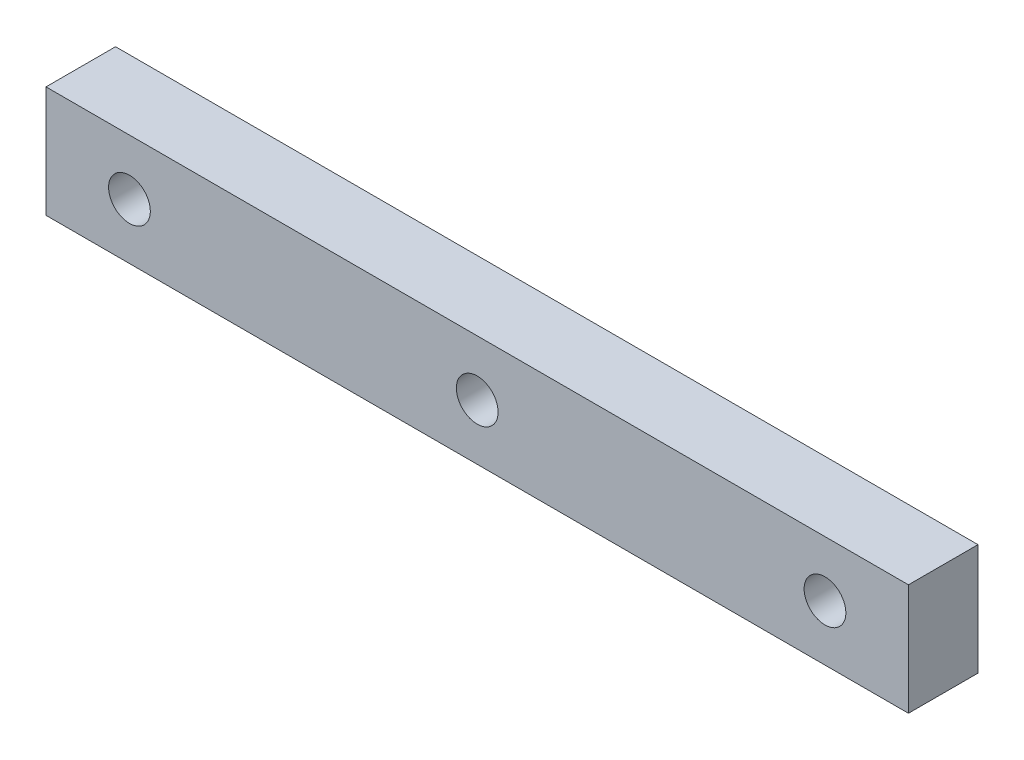
ISO-10303-21;
HEADER;
FILE_DESCRIPTION(('STEP AP214'),'2;1');
FILE_NAME('part.step','',(''),(''),'','','');
FILE_SCHEMA(('AUTOMOTIVE_DESIGN { 1 0 10303 214 1 1 1 1 }'));
ENDSEC;
DATA;
#1=APPLICATION_CONTEXT('core data for automotive mechanical design processes');
#2=APPLICATION_PROTOCOL_DEFINITION('international standard','automotive_design',2000,#1);
#3=PRODUCT_CONTEXT('',#1,'mechanical');
#4=PRODUCT('Part','Part','',(#3));
#5=PRODUCT_RELATED_PRODUCT_CATEGORY('part','',(#4));
#6=PRODUCT_DEFINITION_FORMATION('','',#4);
#7=PRODUCT_DEFINITION_CONTEXT('part definition',#1,'design');
#8=PRODUCT_DEFINITION('design','',#6,#7);
#9=PRODUCT_DEFINITION_SHAPE('','',#8);
#10=(LENGTH_UNIT() NAMED_UNIT(*) SI_UNIT(.MILLI.,.METRE.));
#11=(NAMED_UNIT(*) PLANE_ANGLE_UNIT() SI_UNIT($,.RADIAN.));
#12=(NAMED_UNIT(*) SI_UNIT($,.STERADIAN.) SOLID_ANGLE_UNIT());
#13=UNCERTAINTY_MEASURE_WITH_UNIT(LENGTH_MEASURE(1.E-05),#10,'distance_accuracy_value','');
#14=(GEOMETRIC_REPRESENTATION_CONTEXT(3) GLOBAL_UNCERTAINTY_ASSIGNED_CONTEXT((#13)) GLOBAL_UNIT_ASSIGNED_CONTEXT((#10,
#11,#12)) REPRESENTATION_CONTEXT('',''));
#15=CARTESIAN_POINT('',(0.,0.,0.));
#16=DIRECTION('',(0.,0.,1.));
#17=DIRECTION('',(1.,0.,0.));
#18=AXIS2_PLACEMENT_3D('',#15,#16,#17);
#19=CARTESIAN_POINT('',(-31.,4.,5.));
#20=DIRECTION('',(1.,0.,0.));
#21=DIRECTION('',(0.,0.,-1.));
#22=AXIS2_PLACEMENT_3D('',#19,#20,#21);
#23=PLANE('',#22);
#24=DIRECTION('',(0.,-1.,0.));
#25=VECTOR('',#24,1.);
#26=CARTESIAN_POINT('',(-31.,4.,0.));
#27=LINE('',#26,#25);
#28=CARTESIAN_POINT('',(-31.,4.,0.));
#29=VERTEX_POINT('',#28);
#30=CARTESIAN_POINT('',(-31.,-4.,0.));
#31=VERTEX_POINT('',#30);
#32=EDGE_CURVE('E97',#29,#31,#27,.T.);
#33=ORIENTED_EDGE('',*,*,#32,.T.);
#34=DIRECTION('',(0.,0.,-1.));
#35=VECTOR('',#34,1.);
#36=CARTESIAN_POINT('',(-31.,-4.,5.));
#37=LINE('',#36,#35);
#38=CARTESIAN_POINT('',(-31.,-4.,5.));
#39=VERTEX_POINT('',#38);
#40=EDGE_CURVE('E11',#39,#31,#37,.T.);
#41=ORIENTED_EDGE('',*,*,#40,.F.);
#42=DIRECTION('',(0.,-1.,0.));
#43=VECTOR('',#42,1.);
#44=CARTESIAN_POINT('',(-31.,4.,5.));
#45=LINE('',#44,#43);
#46=CARTESIAN_POINT('',(-31.,4.,5.));
#47=VERTEX_POINT('',#46);
#48=EDGE_CURVE('E85',#47,#39,#45,.T.);
#49=ORIENTED_EDGE('',*,*,#48,.F.);
#50=DIRECTION('',(0.,0.,-1.));
#51=VECTOR('',#50,1.);
#52=CARTESIAN_POINT('',(-31.,4.,5.));
#53=LINE('',#52,#51);
#54=EDGE_CURVE('E93',#47,#29,#53,.T.);
#55=ORIENTED_EDGE('',*,*,#54,.T.);
#56=EDGE_LOOP('',(#33,#41,#49,#55));
#57=FACE_BOUND('',#56,.T.);
#58=ADVANCED_FACE('F34',(#57),#23,.F.);
#59=CARTESIAN_POINT('',(-31.,-4.,5.));
#60=DIRECTION('',(0.,1.,0.));
#61=DIRECTION('',(-1.,0.,0.));
#62=AXIS2_PLACEMENT_3D('',#59,#60,#61);
#63=PLANE('',#62);
#64=DIRECTION('',(1.,0.,0.));
#65=VECTOR('',#64,1.);
#66=CARTESIAN_POINT('',(-31.,-4.,0.));
#67=LINE('',#66,#65);
#68=CARTESIAN_POINT('',(31.,-4.,0.));
#69=VERTEX_POINT('',#68);
#70=EDGE_CURVE('E89',#31,#69,#67,.T.);
#71=ORIENTED_EDGE('',*,*,#70,.T.);
#72=DIRECTION('',(0.,0.,-1.));
#73=VECTOR('',#72,1.);
#74=CARTESIAN_POINT('',(31.,-4.,5.));
#75=LINE('',#74,#73);
#76=CARTESIAN_POINT('',(31.,-4.,5.));
#77=VERTEX_POINT('',#76);
#78=EDGE_CURVE('E42',#77,#69,#75,.T.);
#79=ORIENTED_EDGE('',*,*,#78,.F.);
#80=DIRECTION('',(1.,0.,0.));
#81=VECTOR('',#80,1.);
#82=CARTESIAN_POINT('',(-31.,-4.,5.));
#83=LINE('',#82,#81);
#84=EDGE_CURVE('E80',#39,#77,#83,.T.);
#85=ORIENTED_EDGE('',*,*,#84,.F.);
#86=ORIENTED_EDGE('',*,*,#40,.T.);
#87=EDGE_LOOP('',(#71,#79,#85,#86));
#88=FACE_BOUND('',#87,.T.);
#89=ADVANCED_FACE('F88',(#88),#63,.F.);
#90=CARTESIAN_POINT('',(31.,4.,5.));
#91=DIRECTION('',(-1.,0.,0.));
#92=DIRECTION('',(0.,0.,1.));
#93=AXIS2_PLACEMENT_3D('',#90,#91,#92);
#94=PLANE('',#93);
#95=DIRECTION('',(0.,1.,0.));
#96=VECTOR('',#95,1.);
#97=CARTESIAN_POINT('',(31.,4.,0.));
#98=LINE('',#97,#96);
#99=CARTESIAN_POINT('',(31.,4.,0.));
#100=VERTEX_POINT('',#99);
#101=EDGE_CURVE('E67',#69,#100,#98,.T.);
#102=ORIENTED_EDGE('',*,*,#101,.T.);
#103=DIRECTION('',(0.,0.,-1.));
#104=VECTOR('',#103,1.);
#105=CARTESIAN_POINT('',(31.,4.,5.));
#106=LINE('',#105,#104);
#107=CARTESIAN_POINT('',(31.,4.,5.));
#108=VERTEX_POINT('',#107);
#109=EDGE_CURVE('E90',#108,#100,#106,.T.);
#110=ORIENTED_EDGE('',*,*,#109,.F.);
#111=DIRECTION('',(0.,1.,0.));
#112=VECTOR('',#111,1.);
#113=CARTESIAN_POINT('',(31.,4.,5.));
#114=LINE('',#113,#112);
#115=EDGE_CURVE('E83',#77,#108,#114,.T.);
#116=ORIENTED_EDGE('',*,*,#115,.F.);
#117=ORIENTED_EDGE('',*,*,#78,.T.);
#118=EDGE_LOOP('',(#102,#110,#116,#117));
#119=FACE_BOUND('',#118,.T.);
#120=ADVANCED_FACE('F91',(#119),#94,.F.);
#121=CARTESIAN_POINT('',(-31.,4.,5.));
#122=DIRECTION('',(0.,-1.,0.));
#123=DIRECTION('',(0.,0.,-1.));
#124=AXIS2_PLACEMENT_3D('',#121,#122,#123);
#125=PLANE('',#124);
#126=DIRECTION('',(-1.,0.,0.));
#127=VECTOR('',#126,1.);
#128=CARTESIAN_POINT('',(-31.,4.,0.));
#129=LINE('',#128,#127);
#130=EDGE_CURVE('E73',#100,#29,#129,.T.);
#131=ORIENTED_EDGE('',*,*,#130,.T.);
#132=ORIENTED_EDGE('',*,*,#54,.F.);
#133=DIRECTION('',(-1.,0.,0.));
#134=VECTOR('',#133,1.);
#135=CARTESIAN_POINT('',(-31.,4.,5.));
#136=LINE('',#135,#134);
#137=EDGE_CURVE('E50',#108,#47,#136,.T.);
#138=ORIENTED_EDGE('',*,*,#137,.F.);
#139=ORIENTED_EDGE('',*,*,#109,.T.);
#140=EDGE_LOOP('',(#131,#132,#138,#139));
#141=FACE_BOUND('',#140,.T.);
#142=ADVANCED_FACE('F105',(#141),#125,.F.);
#143=CARTESIAN_POINT('',(0.,0.,5.));
#144=DIRECTION('',(0.,0.,1.));
#145=DIRECTION('',(1.,0.,0.));
#146=AXIS2_PLACEMENT_3D('',#143,#144,#145);
#147=PLANE('',#146);
#148=CARTESIAN_POINT('',(25.,0.,5.));
#149=DIRECTION('',(0.,0.,1.));
#150=DIRECTION('',(1.,0.,0.));
#151=AXIS2_PLACEMENT_3D('',#148,#149,#150);
#152=CIRCLE('',#151,1.5);
#153=CARTESIAN_POINT('',(26.5,0.,5.));
#154=VERTEX_POINT('',#153);
#155=EDGE_CURVE('E100',#154,#154,#152,.T.);
#156=ORIENTED_EDGE('',*,*,#155,.F.);
#157=EDGE_LOOP('',(#156));
#158=FACE_BOUND('',#157,.T.);
#159=CARTESIAN_POINT('',(0.,0.,5.));
#160=DIRECTION('',(0.,0.,1.));
#161=DIRECTION('',(1.,0.,0.));
#162=AXIS2_PLACEMENT_3D('',#159,#160,#161);
#163=CIRCLE('',#162,1.5);
#164=CARTESIAN_POINT('',(1.5,0.,5.));
#165=VERTEX_POINT('',#164);
#166=EDGE_CURVE('E113',#165,#165,#163,.T.);
#167=ORIENTED_EDGE('',*,*,#166,.F.);
#168=EDGE_LOOP('',(#167));
#169=FACE_BOUND('',#168,.T.);
#170=CARTESIAN_POINT('',(-25.,0.,5.));
#171=DIRECTION('',(0.,0.,1.));
#172=DIRECTION('',(1.,0.,0.));
#173=AXIS2_PLACEMENT_3D('',#170,#171,#172);
#174=CIRCLE('',#173,1.5);
#175=CARTESIAN_POINT('',(-23.5,0.,5.));
#176=VERTEX_POINT('',#175);
#177=EDGE_CURVE('E116',#176,#176,#174,.T.);
#178=ORIENTED_EDGE('',*,*,#177,.F.);
#179=EDGE_LOOP('',(#178));
#180=FACE_BOUND('',#179,.T.);
#181=ORIENTED_EDGE('',*,*,#48,.T.);
#182=ORIENTED_EDGE('',*,*,#84,.T.);
#183=ORIENTED_EDGE('',*,*,#115,.T.);
#184=ORIENTED_EDGE('',*,*,#137,.T.);
#185=EDGE_LOOP('',(#181,#182,#183,#184));
#186=FACE_BOUND('',#185,.T.);
#187=ADVANCED_FACE('F81',(#158,#169,#180,#186),#147,.T.);
#188=CARTESIAN_POINT('',(0.,0.,0.));
#189=DIRECTION('',(0.,0.,1.));
#190=DIRECTION('',(1.,0.,0.));
#191=AXIS2_PLACEMENT_3D('',#188,#189,#190);
#192=PLANE('',#191);
#193=CARTESIAN_POINT('',(25.,0.,0.));
#194=DIRECTION('',(0.,0.,-1.));
#195=DIRECTION('',(-1.,0.,0.));
#196=AXIS2_PLACEMENT_3D('',#193,#194,#195);
#197=CIRCLE('',#196,1.5);
#198=CARTESIAN_POINT('',(23.5,0.,0.));
#199=VERTEX_POINT('',#198);
#200=EDGE_CURVE('E119',#199,#199,#197,.T.);
#201=ORIENTED_EDGE('',*,*,#200,.F.);
#202=EDGE_LOOP('',(#201));
#203=FACE_BOUND('',#202,.T.);
#204=CARTESIAN_POINT('',(0.,0.,0.));
#205=DIRECTION('',(0.,0.,-1.));
#206=DIRECTION('',(-1.,0.,0.));
#207=AXIS2_PLACEMENT_3D('',#204,#205,#206);
#208=CIRCLE('',#207,1.5);
#209=CARTESIAN_POINT('',(-1.5,0.,0.));
#210=VERTEX_POINT('',#209);
#211=EDGE_CURVE('E123',#210,#210,#208,.T.);
#212=ORIENTED_EDGE('',*,*,#211,.F.);
#213=EDGE_LOOP('',(#212));
#214=FACE_BOUND('',#213,.T.);
#215=CARTESIAN_POINT('',(-25.,0.,0.));
#216=DIRECTION('',(0.,0.,-1.));
#217=DIRECTION('',(-1.,0.,0.));
#218=AXIS2_PLACEMENT_3D('',#215,#216,#217);
#219=CIRCLE('',#218,1.5);
#220=CARTESIAN_POINT('',(-26.5,0.,0.));
#221=VERTEX_POINT('',#220);
#222=EDGE_CURVE('E120',#221,#221,#219,.T.);
#223=ORIENTED_EDGE('',*,*,#222,.F.);
#224=EDGE_LOOP('',(#223));
#225=FACE_BOUND('',#224,.T.);
#226=ORIENTED_EDGE('',*,*,#32,.F.);
#227=ORIENTED_EDGE('',*,*,#130,.F.);
#228=ORIENTED_EDGE('',*,*,#101,.F.);
#229=ORIENTED_EDGE('',*,*,#70,.F.);
#230=EDGE_LOOP('',(#226,#227,#228,#229));
#231=FACE_BOUND('',#230,.T.);
#232=ADVANCED_FACE('F108',(#203,#214,#225,#231),#192,.F.);
#233=CARTESIAN_POINT('',(-25.,0.,10.));
#234=DIRECTION('',(0.,0.,-1.));
#235=DIRECTION('',(-1.,0.,0.));
#236=AXIS2_PLACEMENT_3D('',#233,#234,#235);
#237=CYLINDRICAL_SURFACE('',#236,1.5);
#238=ORIENTED_EDGE('',*,*,#177,.T.);
#239=EDGE_LOOP('',(#238));
#240=FACE_BOUND('',#239,.T.);
#241=ORIENTED_EDGE('',*,*,#222,.T.);
#242=EDGE_LOOP('',(#241));
#243=FACE_BOUND('',#242,.T.);
#244=ADVANCED_FACE('F133',(#240,#243),#237,.F.);
#245=CARTESIAN_POINT('',(0.,0.,10.));
#246=DIRECTION('',(0.,0.,-1.));
#247=DIRECTION('',(-1.,0.,0.));
#248=AXIS2_PLACEMENT_3D('',#245,#246,#247);
#249=CYLINDRICAL_SURFACE('',#248,1.5);
#250=ORIENTED_EDGE('',*,*,#166,.T.);
#251=EDGE_LOOP('',(#250));
#252=FACE_BOUND('',#251,.T.);
#253=ORIENTED_EDGE('',*,*,#211,.T.);
#254=EDGE_LOOP('',(#253));
#255=FACE_BOUND('',#254,.T.);
#256=ADVANCED_FACE('F140',(#252,#255),#249,.F.);
#257=CARTESIAN_POINT('',(25.,0.,10.));
#258=DIRECTION('',(0.,0.,-1.));
#259=DIRECTION('',(-1.,0.,0.));
#260=AXIS2_PLACEMENT_3D('',#257,#258,#259);
#261=CYLINDRICAL_SURFACE('',#260,1.5);
#262=ORIENTED_EDGE('',*,*,#155,.T.);
#263=EDGE_LOOP('',(#262));
#264=FACE_BOUND('',#263,.T.);
#265=ORIENTED_EDGE('',*,*,#200,.T.);
#266=EDGE_LOOP('',(#265));
#267=FACE_BOUND('',#266,.T.);
#268=ADVANCED_FACE('F129',(#264,#267),#261,.F.);
#269=CLOSED_SHELL('',(#58,#89,#120,#142,#187,#232,#244,#256,#268));
#270=MANIFOLD_SOLID_BREP('B2',#269);
#271=ADVANCED_BREP_SHAPE_REPRESENTATION('',(#18,#270),#14);
#272=SHAPE_DEFINITION_REPRESENTATION(#9,#271);
ENDSEC;
END-ISO-10303-21;
